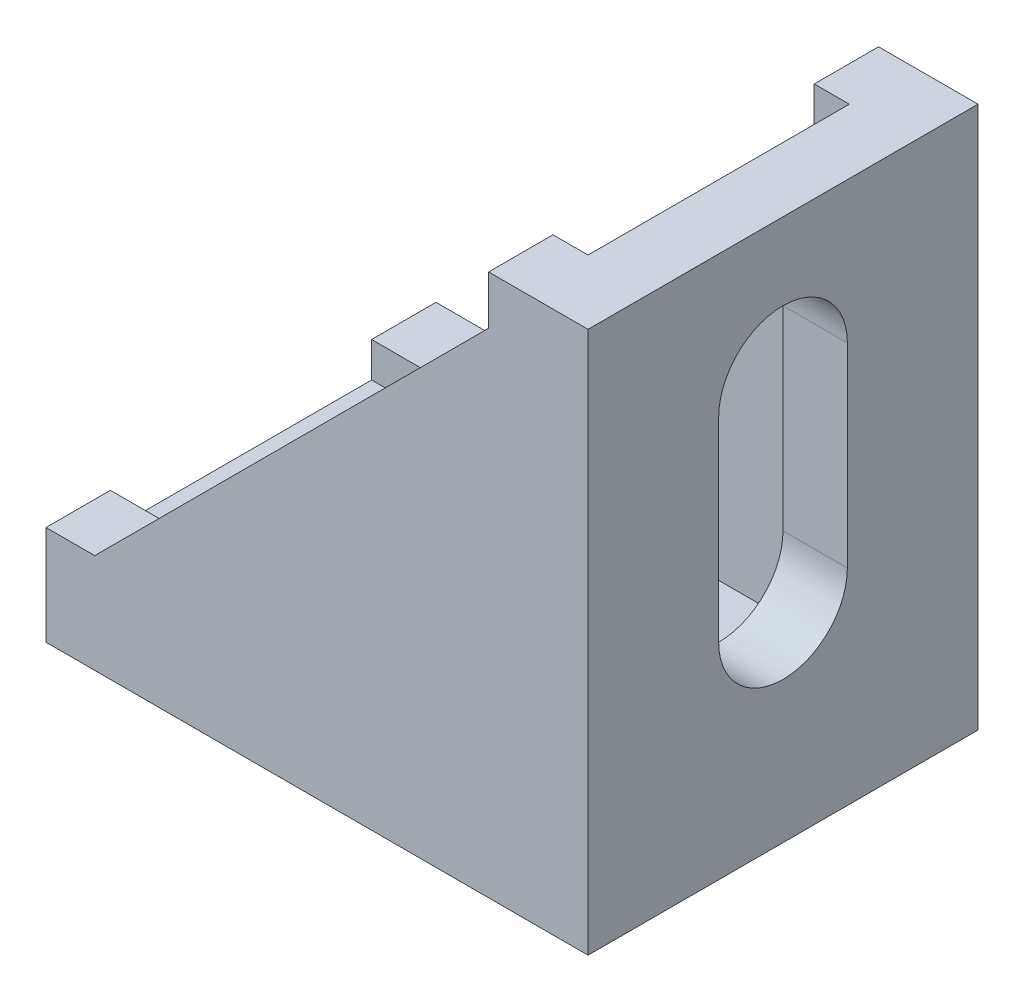
ISO-10303-21;
HEADER;
FILE_DESCRIPTION(('STEP AP214'),'2;1');
FILE_NAME('part.step','',(''),(''),'','','');
FILE_SCHEMA(('AUTOMOTIVE_DESIGN { 1 0 10303 214 1 1 1 1 }'));
ENDSEC;
DATA;
#1=APPLICATION_CONTEXT('core data for automotive mechanical design processes');
#2=APPLICATION_PROTOCOL_DEFINITION('international standard','automotive_design',2000,#1);
#3=PRODUCT_CONTEXT('',#1,'mechanical');
#4=PRODUCT('Part','Part','',(#3));
#5=PRODUCT_RELATED_PRODUCT_CATEGORY('part','',(#4));
#6=PRODUCT_DEFINITION_FORMATION('','',#4);
#7=PRODUCT_DEFINITION_CONTEXT('part definition',#1,'design');
#8=PRODUCT_DEFINITION('design','',#6,#7);
#9=PRODUCT_DEFINITION_SHAPE('','',#8);
#10=(LENGTH_UNIT() NAMED_UNIT(*) SI_UNIT(.MILLI.,.METRE.));
#11=(NAMED_UNIT(*) PLANE_ANGLE_UNIT() SI_UNIT($,.RADIAN.));
#12=(NAMED_UNIT(*) SI_UNIT($,.STERADIAN.) SOLID_ANGLE_UNIT());
#13=UNCERTAINTY_MEASURE_WITH_UNIT(LENGTH_MEASURE(1.E-05),#10,'distance_accuracy_value','');
#14=(GEOMETRIC_REPRESENTATION_CONTEXT(3) GLOBAL_UNCERTAINTY_ASSIGNED_CONTEXT((#13)) GLOBAL_UNIT_ASSIGNED_CONTEXT((#10,
#11,#12)) REPRESENTATION_CONTEXT('',''));
#15=CARTESIAN_POINT('',(0.,0.,0.));
#16=DIRECTION('',(0.,0.,1.));
#17=DIRECTION('',(1.,0.,0.));
#18=AXIS2_PLACEMENT_3D('',#15,#16,#17);
#19=CARTESIAN_POINT('',(13.9,3.3,-10.));
#20=DIRECTION('',(-1.,0.,0.));
#21=DIRECTION('',(0.,0.,1.));
#22=AXIS2_PLACEMENT_3D('',#19,#20,#21);
#23=PLANE('',#22);
#24=DIRECTION('',(0.,1.,0.));
#25=VECTOR('',#24,1.);
#26=CARTESIAN_POINT('',(13.9,3.3,3.3));
#27=LINE('',#26,#25);
#28=CARTESIAN_POINT('',(13.9,10.55,3.3));
#29=VERTEX_POINT('',#28);
#30=CARTESIAN_POINT('',(13.9,20.55,3.3));
#31=VERTEX_POINT('',#30);
#32=EDGE_CURVE('E239',#29,#31,#27,.T.);
#33=ORIENTED_EDGE('',*,*,#32,.T.);
#34=CARTESIAN_POINT('',(13.9,20.55,0.));
#35=DIRECTION('',(-1.,0.,0.));
#36=DIRECTION('',(0.,0.,1.));
#37=AXIS2_PLACEMENT_3D('',#34,#35,#36);
#38=CIRCLE('',#37,3.3);
#39=CARTESIAN_POINT('',(13.9,20.55,-3.3));
#40=VERTEX_POINT('',#39);
#41=EDGE_CURVE('E242',#31,#40,#38,.T.);
#42=ORIENTED_EDGE('',*,*,#41,.T.);
#43=DIRECTION('',(0.,-1.,0.));
#44=VECTOR('',#43,1.);
#45=CARTESIAN_POINT('',(13.9,3.3,-3.3));
#46=LINE('',#45,#44);
#47=CARTESIAN_POINT('',(13.9,10.55,-3.3));
#48=VERTEX_POINT('',#47);
#49=EDGE_CURVE('E227',#40,#48,#46,.T.);
#50=ORIENTED_EDGE('',*,*,#49,.T.);
#51=CARTESIAN_POINT('',(13.9,10.55,0.));
#52=DIRECTION('',(-1.,0.,0.));
#53=DIRECTION('',(0.,0.,1.));
#54=AXIS2_PLACEMENT_3D('',#51,#52,#53);
#55=CIRCLE('',#54,3.3);
#56=EDGE_CURVE('E236',#48,#29,#55,.T.);
#57=ORIENTED_EDGE('',*,*,#56,.T.);
#58=EDGE_LOOP('',(#33,#42,#50,#57));
#59=FACE_BOUND('',#58,.T.);
#60=DIRECTION('',(0.,0.,-1.));
#61=VECTOR('',#60,1.);
#62=CARTESIAN_POINT('',(13.9,0.,-10.));
#63=LINE('',#62,#61);
#64=CARTESIAN_POINT('',(13.9,0.,10.));
#65=VERTEX_POINT('',#64);
#66=CARTESIAN_POINT('',(13.9,0.,-10.));
#67=VERTEX_POINT('',#66);
#68=EDGE_CURVE('E317',#65,#67,#63,.T.);
#69=ORIENTED_EDGE('',*,*,#68,.T.);
#70=DIRECTION('',(0.,-1.,0.));
#71=VECTOR('',#70,1.);
#72=CARTESIAN_POINT('',(13.9,3.3,-10.));
#73=LINE('',#72,#71);
#74=CARTESIAN_POINT('',(13.9,27.8,-10.));
#75=VERTEX_POINT('',#74);
#76=EDGE_CURVE('E338',#75,#67,#73,.T.);
#77=ORIENTED_EDGE('',*,*,#76,.F.);
#78=DIRECTION('',(0.,0.,-1.));
#79=VECTOR('',#78,1.);
#80=CARTESIAN_POINT('',(13.9,27.8,10.));
#81=LINE('',#80,#79);
#82=CARTESIAN_POINT('',(13.9,27.8,10.));
#83=VERTEX_POINT('',#82);
#84=EDGE_CURVE('E297',#83,#75,#81,.T.);
#85=ORIENTED_EDGE('',*,*,#84,.F.);
#86=DIRECTION('',(0.,-1.,0.));
#87=VECTOR('',#86,1.);
#88=CARTESIAN_POINT('',(13.9,3.3,10.));
#89=LINE('',#88,#87);
#90=EDGE_CURVE('E321',#83,#65,#89,.T.);
#91=ORIENTED_EDGE('',*,*,#90,.T.);
#92=EDGE_LOOP('',(#69,#77,#85,#91));
#93=FACE_BOUND('',#92,.T.);
#94=ADVANCED_FACE('F37',(#59,#93),#23,.F.);
#95=CARTESIAN_POINT('',(-13.9,3.3,-10.));
#96=DIRECTION('',(0.,0.,1.));
#97=DIRECTION('',(1.,0.,0.));
#98=AXIS2_PLACEMENT_3D('',#95,#96,#97);
#99=PLANE('',#98);
#100=DIRECTION('',(0.707106781186547,0.707106781186548,0.));
#101=VECTOR('',#100,1.);
#102=CARTESIAN_POINT('',(-13.5492256094248,2.94922560942482,-10.));
#103=LINE('',#102,#101);
#104=CARTESIAN_POINT('',(-11.4,5.09845121884964,-10.));
#105=VERTEX_POINT('',#104);
#106=CARTESIAN_POINT('',(8.80154878115036,25.3,-10.));
#107=VERTEX_POINT('',#106);
#108=EDGE_CURVE('E280',#105,#107,#103,.T.);
#109=ORIENTED_EDGE('',*,*,#108,.T.);
#110=DIRECTION('',(0.,1.,0.));
#111=VECTOR('',#110,1.);
#112=CARTESIAN_POINT('',(8.80154878115036,3.3,-10.));
#113=LINE('',#112,#111);
#114=CARTESIAN_POINT('',(8.80154878115036,27.8,-10.));
#115=VERTEX_POINT('',#114);
#116=EDGE_CURVE('E268',#107,#115,#113,.T.);
#117=ORIENTED_EDGE('',*,*,#116,.T.);
#118=DIRECTION('',(-1.,0.,0.));
#119=VECTOR('',#118,1.);
#120=CARTESIAN_POINT('',(13.9,27.8,-10.));
#121=LINE('',#120,#119);
#122=EDGE_CURVE('E284',#75,#115,#121,.T.);
#123=ORIENTED_EDGE('',*,*,#122,.F.);
#124=ORIENTED_EDGE('',*,*,#76,.T.);
#125=DIRECTION('',(-1.,0.,0.));
#126=VECTOR('',#125,1.);
#127=CARTESIAN_POINT('',(-13.9,0.,-10.));
#128=LINE('',#127,#126);
#129=CARTESIAN_POINT('',(-13.9,0.,-10.));
#130=VERTEX_POINT('',#129);
#131=EDGE_CURVE('E325',#67,#130,#128,.T.);
#132=ORIENTED_EDGE('',*,*,#131,.T.);
#133=DIRECTION('',(0.,-1.,0.));
#134=VECTOR('',#133,1.);
#135=CARTESIAN_POINT('',(-13.9,3.3,-10.));
#136=LINE('',#135,#134);
#137=CARTESIAN_POINT('',(-13.9,5.09845121884964,-10.));
#138=VERTEX_POINT('',#137);
#139=EDGE_CURVE('E336',#138,#130,#136,.T.);
#140=ORIENTED_EDGE('',*,*,#139,.F.);
#141=DIRECTION('',(1.,0.,0.));
#142=VECTOR('',#141,1.);
#143=CARTESIAN_POINT('',(-13.9,5.09845121884964,-10.));
#144=LINE('',#143,#142);
#145=EDGE_CURVE('E274',#138,#105,#144,.T.);
#146=ORIENTED_EDGE('',*,*,#145,.T.);
#147=EDGE_LOOP('',(#109,#117,#123,#124,#132,#140,#146));
#148=FACE_BOUND('',#147,.T.);
#149=ADVANCED_FACE('F374',(#148),#99,.F.);
#150=CARTESIAN_POINT('',(-13.9,3.3,-10.));
#151=DIRECTION('',(1.,0.,0.));
#152=DIRECTION('',(0.,0.,-1.));
#153=AXIS2_PLACEMENT_3D('',#150,#151,#152);
#154=PLANE('',#153);
#155=DIRECTION('',(0.,-1.,0.));
#156=VECTOR('',#155,1.);
#157=CARTESIAN_POINT('',(-13.9,3.3,10.));
#158=LINE('',#157,#156);
#159=CARTESIAN_POINT('',(-13.9,5.09845121884964,10.));
#160=VERTEX_POINT('',#159);
#161=CARTESIAN_POINT('',(-13.9,0.,10.));
#162=VERTEX_POINT('',#161);
#163=EDGE_CURVE('E334',#160,#162,#158,.T.);
#164=ORIENTED_EDGE('',*,*,#163,.F.);
#165=DIRECTION('',(0.,0.,1.));
#166=VECTOR('',#165,1.);
#167=CARTESIAN_POINT('',(-13.9,5.09845121884964,-14.8));
#168=LINE('',#167,#166);
#169=CARTESIAN_POINT('',(-13.9,5.09845121884964,6.69999999999999));
#170=VERTEX_POINT('',#169);
#171=EDGE_CURVE('E253',#170,#160,#168,.T.);
#172=ORIENTED_EDGE('',*,*,#171,.F.);
#173=DIRECTION('',(0.,-1.,0.));
#174=VECTOR('',#173,1.);
#175=CARTESIAN_POINT('',(-13.9,27.8,6.7));
#176=LINE('',#175,#174);
#177=CARTESIAN_POINT('',(-13.9,3.3,6.7));
#178=VERTEX_POINT('',#177);
#179=EDGE_CURVE('E300',#170,#178,#176,.T.);
#180=ORIENTED_EDGE('',*,*,#179,.T.);
#181=DIRECTION('',(0.,0.,1.));
#182=VECTOR('',#181,1.);
#183=CARTESIAN_POINT('',(-13.9,3.3,-10.));
#184=LINE('',#183,#182);
#185=CARTESIAN_POINT('',(-13.9,3.3,-6.7));
#186=VERTEX_POINT('',#185);
#187=EDGE_CURVE('E318',#186,#178,#184,.T.);
#188=ORIENTED_EDGE('',*,*,#187,.F.);
#189=DIRECTION('',(0.,-1.,0.));
#190=VECTOR('',#189,1.);
#191=CARTESIAN_POINT('',(-13.9,27.8,-6.7));
#192=LINE('',#191,#190);
#193=CARTESIAN_POINT('',(-13.9,5.09845121884964,-6.7));
#194=VERTEX_POINT('',#193);
#195=EDGE_CURVE('E315',#194,#186,#192,.T.);
#196=ORIENTED_EDGE('',*,*,#195,.F.);
#197=EDGE_CURVE('E260',#138,#194,#168,.T.);
#198=ORIENTED_EDGE('',*,*,#197,.F.);
#199=ORIENTED_EDGE('',*,*,#139,.T.);
#200=DIRECTION('',(0.,0.,1.));
#201=VECTOR('',#200,1.);
#202=CARTESIAN_POINT('',(-13.9,0.,-10.));
#203=LINE('',#202,#201);
#204=EDGE_CURVE('E328',#130,#162,#203,.T.);
#205=ORIENTED_EDGE('',*,*,#204,.T.);
#206=EDGE_LOOP('',(#164,#172,#180,#188,#196,#198,#199,#205));
#207=FACE_BOUND('',#206,.T.);
#208=ADVANCED_FACE('F379',(#207),#154,.F.);
#209=CARTESIAN_POINT('',(-13.9,3.3,10.));
#210=DIRECTION('',(0.,0.,-1.));
#211=DIRECTION('',(-1.,0.,0.));
#212=AXIS2_PLACEMENT_3D('',#209,#210,#211);
#213=PLANE('',#212);
#214=DIRECTION('',(1.,0.,0.));
#215=VECTOR('',#214,1.);
#216=CARTESIAN_POINT('',(-13.9,27.8,10.));
#217=LINE('',#216,#215);
#218=CARTESIAN_POINT('',(8.80154878115036,27.8,10.));
#219=VERTEX_POINT('',#218);
#220=EDGE_CURVE('E295',#219,#83,#217,.T.);
#221=ORIENTED_EDGE('',*,*,#220,.F.);
#222=DIRECTION('',(0.,1.,0.));
#223=VECTOR('',#222,1.);
#224=CARTESIAN_POINT('',(8.80154878115036,27.8,10.));
#225=LINE('',#224,#223);
#226=CARTESIAN_POINT('',(8.80154878115036,25.3,10.));
#227=VERTEX_POINT('',#226);
#228=EDGE_CURVE('E251',#227,#219,#225,.T.);
#229=ORIENTED_EDGE('',*,*,#228,.F.);
#230=DIRECTION('',(0.707106781186547,0.707106781186548,0.));
#231=VECTOR('',#230,1.);
#232=CARTESIAN_POINT('',(-11.4,5.09845121884964,10.));
#233=LINE('',#232,#231);
#234=CARTESIAN_POINT('',(-11.4,5.09845121884964,10.));
#235=VERTEX_POINT('',#234);
#236=EDGE_CURVE('E248',#235,#227,#233,.T.);
#237=ORIENTED_EDGE('',*,*,#236,.F.);
#238=DIRECTION('',(1.,0.,0.));
#239=VECTOR('',#238,1.);
#240=CARTESIAN_POINT('',(-13.9,5.09845121884964,10.));
#241=LINE('',#240,#239);
#242=EDGE_CURVE('E245',#160,#235,#241,.T.);
#243=ORIENTED_EDGE('',*,*,#242,.F.);
#244=ORIENTED_EDGE('',*,*,#163,.T.);
#245=DIRECTION('',(1.,0.,0.));
#246=VECTOR('',#245,1.);
#247=CARTESIAN_POINT('',(-13.9,0.,10.));
#248=LINE('',#247,#246);
#249=EDGE_CURVE('E322',#162,#65,#248,.T.);
#250=ORIENTED_EDGE('',*,*,#249,.T.);
#251=ORIENTED_EDGE('',*,*,#90,.F.);
#252=EDGE_LOOP('',(#221,#229,#237,#243,#244,#250,#251));
#253=FACE_BOUND('',#252,.T.);
#254=ADVANCED_FACE('F397',(#253),#213,.F.);
#255=CARTESIAN_POINT('',(0.,3.3,0.));
#256=DIRECTION('',(0.,1.,0.));
#257=DIRECTION('',(0.,0.,1.));
#258=AXIS2_PLACEMENT_3D('',#255,#256,#257);
#259=PLANE('',#258);
#260=CARTESIAN_POINT('',(3.35,3.3,0.));
#261=DIRECTION('',(0.,1.,0.));
#262=DIRECTION('',(0.,0.,1.));
#263=AXIS2_PLACEMENT_3D('',#260,#261,#262);
#264=CIRCLE('',#263,3.3);
#265=CARTESIAN_POINT('',(3.35,3.3,3.3));
#266=VERTEX_POINT('',#265);
#267=CARTESIAN_POINT('',(3.35,3.3,-3.3));
#268=VERTEX_POINT('',#267);
#269=EDGE_CURVE('E51',#266,#268,#264,.T.);
#270=ORIENTED_EDGE('',*,*,#269,.F.);
#271=DIRECTION('',(1.,0.,0.));
#272=VECTOR('',#271,1.);
#273=CARTESIAN_POINT('',(3.35,3.3,3.3));
#274=LINE('',#273,#272);
#275=CARTESIAN_POINT('',(-6.65,3.3,3.3));
#276=VERTEX_POINT('',#275);
#277=EDGE_CURVE('E204',#276,#266,#274,.T.);
#278=ORIENTED_EDGE('',*,*,#277,.F.);
#279=CARTESIAN_POINT('',(-6.65,3.3,0.));
#280=DIRECTION('',(0.,1.,0.));
#281=DIRECTION('',(0.,0.,1.));
#282=AXIS2_PLACEMENT_3D('',#279,#280,#281);
#283=CIRCLE('',#282,3.3);
#284=CARTESIAN_POINT('',(-6.65,3.3,-3.3));
#285=VERTEX_POINT('',#284);
#286=EDGE_CURVE('E188',#285,#276,#283,.T.);
#287=ORIENTED_EDGE('',*,*,#286,.F.);
#288=DIRECTION('',(-1.,0.,0.));
#289=VECTOR('',#288,1.);
#290=CARTESIAN_POINT('',(3.35,3.3,-3.3));
#291=LINE('',#290,#289);
#292=EDGE_CURVE('E197',#268,#285,#291,.T.);
#293=ORIENTED_EDGE('',*,*,#292,.F.);
#294=EDGE_LOOP('',(#270,#278,#287,#293));
#295=FACE_BOUND('',#294,.T.);
#296=DIRECTION('',(-1.,0.,0.));
#297=VECTOR('',#296,1.);
#298=CARTESIAN_POINT('',(10.6,3.3,6.7));
#299=LINE('',#298,#297);
#300=CARTESIAN_POINT('',(10.6,3.3,6.7));
#301=VERTEX_POINT('',#300);
#302=EDGE_CURVE('E288',#301,#178,#299,.T.);
#303=ORIENTED_EDGE('',*,*,#302,.F.);
#304=DIRECTION('',(0.,0.,1.));
#305=VECTOR('',#304,1.);
#306=CARTESIAN_POINT('',(10.6,3.3,-6.7));
#307=LINE('',#306,#305);
#308=CARTESIAN_POINT('',(10.6,3.3,-6.7));
#309=VERTEX_POINT('',#308);
#310=EDGE_CURVE('E303',#309,#301,#307,.T.);
#311=ORIENTED_EDGE('',*,*,#310,.F.);
#312=DIRECTION('',(1.,0.,0.));
#313=VECTOR('',#312,1.);
#314=CARTESIAN_POINT('',(-13.9,3.3,-6.7));
#315=LINE('',#314,#313);
#316=EDGE_CURVE('E283',#186,#309,#315,.T.);
#317=ORIENTED_EDGE('',*,*,#316,.F.);
#318=ORIENTED_EDGE('',*,*,#187,.T.);
#319=EDGE_LOOP('',(#303,#311,#317,#318));
#320=FACE_BOUND('',#319,.T.);
#321=ADVANCED_FACE('F201',(#295,#320),#259,.T.);
#322=CARTESIAN_POINT('',(0.,0.,0.));
#323=DIRECTION('',(0.,1.,0.));
#324=DIRECTION('',(0.,0.,1.));
#325=AXIS2_PLACEMENT_3D('',#322,#323,#324);
#326=PLANE('',#325);
#327=DIRECTION('',(1.,0.,0.));
#328=VECTOR('',#327,1.);
#329=CARTESIAN_POINT('',(0.,0.,3.3));
#330=LINE('',#329,#328);
#331=CARTESIAN_POINT('',(-6.65,0.,3.3));
#332=VERTEX_POINT('',#331);
#333=CARTESIAN_POINT('',(3.35,0.,3.3));
#334=VERTEX_POINT('',#333);
#335=EDGE_CURVE('E44',#332,#334,#330,.T.);
#336=ORIENTED_EDGE('',*,*,#335,.T.);
#337=CARTESIAN_POINT('',(3.35,0.,0.));
#338=DIRECTION('',(0.,1.,0.));
#339=DIRECTION('',(0.,0.,1.));
#340=AXIS2_PLACEMENT_3D('',#337,#338,#339);
#341=CIRCLE('',#340,3.3);
#342=CARTESIAN_POINT('',(3.35,0.,-3.3));
#343=VERTEX_POINT('',#342);
#344=EDGE_CURVE('E11',#334,#343,#341,.T.);
#345=ORIENTED_EDGE('',*,*,#344,.T.);
#346=DIRECTION('',(-1.,0.,0.));
#347=VECTOR('',#346,1.);
#348=CARTESIAN_POINT('',(0.,0.,-3.3));
#349=LINE('',#348,#347);
#350=CARTESIAN_POINT('',(-6.65,0.,-3.3));
#351=VERTEX_POINT('',#350);
#352=EDGE_CURVE('E350',#343,#351,#349,.T.);
#353=ORIENTED_EDGE('',*,*,#352,.T.);
#354=CARTESIAN_POINT('',(-6.65,0.,0.));
#355=DIRECTION('',(0.,1.,0.));
#356=DIRECTION('',(0.,0.,1.));
#357=AXIS2_PLACEMENT_3D('',#354,#355,#356);
#358=CIRCLE('',#357,3.3);
#359=EDGE_CURVE('E191',#351,#332,#358,.T.);
#360=ORIENTED_EDGE('',*,*,#359,.T.);
#361=EDGE_LOOP('',(#336,#345,#353,#360));
#362=FACE_BOUND('',#361,.T.);
#363=ORIENTED_EDGE('',*,*,#68,.F.);
#364=ORIENTED_EDGE('',*,*,#249,.F.);
#365=ORIENTED_EDGE('',*,*,#204,.F.);
#366=ORIENTED_EDGE('',*,*,#131,.F.);
#367=EDGE_LOOP('',(#363,#364,#365,#366));
#368=FACE_BOUND('',#367,.T.);
#369=ADVANCED_FACE('F354',(#362,#368),#326,.F.);
#370=CARTESIAN_POINT('',(-13.9,27.8,-6.7));
#371=DIRECTION('',(0.,0.,-1.));
#372=DIRECTION('',(-1.,0.,0.));
#373=AXIS2_PLACEMENT_3D('',#370,#371,#372);
#374=PLANE('',#373);
#375=DIRECTION('',(1.,0.,0.));
#376=VECTOR('',#375,1.);
#377=CARTESIAN_POINT('',(-13.9,27.8,-6.7));
#378=LINE('',#377,#376);
#379=CARTESIAN_POINT('',(8.80154878115036,27.8,-6.7));
#380=VERTEX_POINT('',#379);
#381=CARTESIAN_POINT('',(10.6,27.8,-6.7));
#382=VERTEX_POINT('',#381);
#383=EDGE_CURVE('E287',#380,#382,#378,.T.);
#384=ORIENTED_EDGE('',*,*,#383,.F.);
#385=DIRECTION('',(0.,-1.,0.));
#386=VECTOR('',#385,1.);
#387=CARTESIAN_POINT('',(8.80154878115036,27.8,-6.7));
#388=LINE('',#387,#386);
#389=CARTESIAN_POINT('',(8.80154878115036,25.3,-6.7));
#390=VERTEX_POINT('',#389);
#391=EDGE_CURVE('E265',#380,#390,#388,.T.);
#392=ORIENTED_EDGE('',*,*,#391,.T.);
#393=DIRECTION('',(-0.707106781186547,-0.707106781186548,0.));
#394=VECTOR('',#393,1.);
#395=CARTESIAN_POINT('',(-1.29922560942482,15.1992256094248,-6.7));
#396=LINE('',#395,#394);
#397=CARTESIAN_POINT('',(-11.4,5.09845121884964,-6.7));
#398=VERTEX_POINT('',#397);
#399=EDGE_CURVE('E277',#390,#398,#396,.T.);
#400=ORIENTED_EDGE('',*,*,#399,.T.);
#401=DIRECTION('',(-1.,0.,0.));
#402=VECTOR('',#401,1.);
#403=CARTESIAN_POINT('',(-13.9,5.09845121884964,-6.7));
#404=LINE('',#403,#402);
#405=EDGE_CURVE('E271',#398,#194,#404,.T.);
#406=ORIENTED_EDGE('',*,*,#405,.T.);
#407=ORIENTED_EDGE('',*,*,#195,.T.);
#408=ORIENTED_EDGE('',*,*,#316,.T.);
#409=DIRECTION('',(0.,-1.,0.));
#410=VECTOR('',#409,1.);
#411=CARTESIAN_POINT('',(10.6,27.8,-6.7));
#412=LINE('',#411,#410);
#413=EDGE_CURVE('E312',#382,#309,#412,.T.);
#414=ORIENTED_EDGE('',*,*,#413,.F.);
#415=EDGE_LOOP('',(#384,#392,#400,#406,#407,#408,#414));
#416=FACE_BOUND('',#415,.T.);
#417=ADVANCED_FACE('F414',(#416),#374,.F.);
#418=CARTESIAN_POINT('',(10.6,27.8,-6.7));
#419=DIRECTION('',(1.,0.,0.));
#420=DIRECTION('',(0.,0.,-1.));
#421=AXIS2_PLACEMENT_3D('',#418,#419,#420);
#422=PLANE('',#421);
#423=DIRECTION('',(0.,-1.,0.));
#424=VECTOR('',#423,1.);
#425=CARTESIAN_POINT('',(10.6,20.55,-3.3));
#426=LINE('',#425,#424);
#427=CARTESIAN_POINT('',(10.6,20.55,-3.3));
#428=VERTEX_POINT('',#427);
#429=CARTESIAN_POINT('',(10.6,10.55,-3.3));
#430=VERTEX_POINT('',#429);
#431=EDGE_CURVE('E215',#428,#430,#426,.T.);
#432=ORIENTED_EDGE('',*,*,#431,.F.);
#433=CARTESIAN_POINT('',(10.6,20.55,0.));
#434=DIRECTION('',(-1.,0.,0.));
#435=DIRECTION('',(0.,0.,1.));
#436=AXIS2_PLACEMENT_3D('',#433,#434,#435);
#437=CIRCLE('',#436,3.3);
#438=CARTESIAN_POINT('',(10.6,20.55,3.3));
#439=VERTEX_POINT('',#438);
#440=EDGE_CURVE('E211',#439,#428,#437,.T.);
#441=ORIENTED_EDGE('',*,*,#440,.F.);
#442=DIRECTION('',(0.,1.,0.));
#443=VECTOR('',#442,1.);
#444=CARTESIAN_POINT('',(10.6,20.55,3.3));
#445=LINE('',#444,#443);
#446=CARTESIAN_POINT('',(10.6,10.55,3.3));
#447=VERTEX_POINT('',#446);
#448=EDGE_CURVE('E221',#447,#439,#445,.T.);
#449=ORIENTED_EDGE('',*,*,#448,.F.);
#450=CARTESIAN_POINT('',(10.6,10.55,0.));
#451=DIRECTION('',(-1.,0.,0.));
#452=DIRECTION('',(0.,0.,1.));
#453=AXIS2_PLACEMENT_3D('',#450,#451,#452);
#454=CIRCLE('',#453,3.3);
#455=EDGE_CURVE('E218',#430,#447,#454,.T.);
#456=ORIENTED_EDGE('',*,*,#455,.F.);
#457=EDGE_LOOP('',(#432,#441,#449,#456));
#458=FACE_BOUND('',#457,.T.);
#459=ORIENTED_EDGE('',*,*,#310,.T.);
#460=DIRECTION('',(0.,-1.,0.));
#461=VECTOR('',#460,1.);
#462=CARTESIAN_POINT('',(10.6,27.8,6.7));
#463=LINE('',#462,#461);
#464=CARTESIAN_POINT('',(10.6,27.8,6.7));
#465=VERTEX_POINT('',#464);
#466=EDGE_CURVE('E309',#465,#301,#463,.T.);
#467=ORIENTED_EDGE('',*,*,#466,.F.);
#468=DIRECTION('',(0.,0.,1.));
#469=VECTOR('',#468,1.);
#470=CARTESIAN_POINT('',(10.6,27.8,-6.7));
#471=LINE('',#470,#469);
#472=EDGE_CURVE('E290',#382,#465,#471,.T.);
#473=ORIENTED_EDGE('',*,*,#472,.F.);
#474=ORIENTED_EDGE('',*,*,#413,.T.);
#475=EDGE_LOOP('',(#459,#467,#473,#474));
#476=FACE_BOUND('',#475,.T.);
#477=ADVANCED_FACE('F452',(#458,#476),#422,.F.);
#478=CARTESIAN_POINT('',(10.6,27.8,6.7));
#479=DIRECTION('',(0.,0.,1.));
#480=DIRECTION('',(1.,0.,0.));
#481=AXIS2_PLACEMENT_3D('',#478,#479,#480);
#482=PLANE('',#481);
#483=DIRECTION('',(0.707106781186547,0.707106781186548,0.));
#484=VECTOR('',#483,1.);
#485=CARTESIAN_POINT('',(10.9507743905752,27.4492256094248,6.7));
#486=LINE('',#485,#484);
#487=CARTESIAN_POINT('',(-11.4,5.09845121884964,6.69999999999999));
#488=VERTEX_POINT('',#487);
#489=CARTESIAN_POINT('',(8.80154878115036,25.3,6.69999999999999));
#490=VERTEX_POINT('',#489);
#491=EDGE_CURVE('E347',#488,#490,#486,.T.);
#492=ORIENTED_EDGE('',*,*,#491,.T.);
#493=DIRECTION('',(0.,1.,0.));
#494=VECTOR('',#493,1.);
#495=CARTESIAN_POINT('',(8.80154878115036,27.8,6.7));
#496=LINE('',#495,#494);
#497=CARTESIAN_POINT('',(8.80154878115036,27.8,6.69999999999999));
#498=VERTEX_POINT('',#497);
#499=EDGE_CURVE('E262',#490,#498,#496,.T.);
#500=ORIENTED_EDGE('',*,*,#499,.T.);
#501=DIRECTION('',(-1.,0.,0.));
#502=VECTOR('',#501,1.);
#503=CARTESIAN_POINT('',(10.6,27.8,6.7));
#504=LINE('',#503,#502);
#505=EDGE_CURVE('E292',#465,#498,#504,.T.);
#506=ORIENTED_EDGE('',*,*,#505,.F.);
#507=ORIENTED_EDGE('',*,*,#466,.T.);
#508=ORIENTED_EDGE('',*,*,#302,.T.);
#509=ORIENTED_EDGE('',*,*,#179,.F.);
#510=DIRECTION('',(1.,0.,0.));
#511=VECTOR('',#510,1.);
#512=CARTESIAN_POINT('',(10.6,5.09845121884961,6.7));
#513=LINE('',#512,#511);
#514=EDGE_CURVE('E344',#170,#488,#513,.T.);
#515=ORIENTED_EDGE('',*,*,#514,.T.);
#516=EDGE_LOOP('',(#492,#500,#506,#507,#508,#509,#515));
#517=FACE_BOUND('',#516,.T.);
#518=ADVANCED_FACE('F427',(#517),#482,.F.);
#519=CARTESIAN_POINT('',(0.,27.8,0.));
#520=DIRECTION('',(0.,1.,0.));
#521=DIRECTION('',(0.,0.,1.));
#522=AXIS2_PLACEMENT_3D('',#519,#520,#521);
#523=PLANE('',#522);
#524=DIRECTION('',(0.,0.,-1.));
#525=VECTOR('',#524,1.);
#526=CARTESIAN_POINT('',(8.80154878115036,27.8,0.));
#527=LINE('',#526,#525);
#528=EDGE_CURVE('E343',#219,#498,#527,.T.);
#529=ORIENTED_EDGE('',*,*,#528,.F.);
#530=ORIENTED_EDGE('',*,*,#220,.T.);
#531=ORIENTED_EDGE('',*,*,#84,.T.);
#532=ORIENTED_EDGE('',*,*,#122,.T.);
#533=EDGE_CURVE('E341',#380,#115,#527,.T.);
#534=ORIENTED_EDGE('',*,*,#533,.F.);
#535=ORIENTED_EDGE('',*,*,#383,.T.);
#536=ORIENTED_EDGE('',*,*,#472,.T.);
#537=ORIENTED_EDGE('',*,*,#505,.T.);
#538=EDGE_LOOP('',(#529,#530,#531,#532,#534,#535,#536,#537));
#539=FACE_BOUND('',#538,.T.);
#540=ADVANCED_FACE('F392',(#539),#523,.T.);
#541=CARTESIAN_POINT('',(8.80154878115036,27.8,-14.8));
#542=DIRECTION('',(1.,0.,0.));
#543=DIRECTION('',(0.,0.,-1.));
#544=AXIS2_PLACEMENT_3D('',#541,#542,#543);
#545=PLANE('',#544);
#546=DIRECTION('',(0.,0.,1.));
#547=VECTOR('',#546,1.);
#548=CARTESIAN_POINT('',(8.80154878115036,25.3,-14.8));
#549=LINE('',#548,#547);
#550=EDGE_CURVE('E256',#107,#390,#549,.T.);
#551=ORIENTED_EDGE('',*,*,#550,.T.);
#552=ORIENTED_EDGE('',*,*,#391,.F.);
#553=ORIENTED_EDGE('',*,*,#533,.T.);
#554=ORIENTED_EDGE('',*,*,#116,.F.);
#555=EDGE_LOOP('',(#551,#552,#553,#554));
#556=FACE_BOUND('',#555,.T.);
#557=ADVANCED_FACE('F417',(#556),#545,.F.);
#558=CARTESIAN_POINT('',(-13.9,5.09845121884964,-14.8));
#559=DIRECTION('',(0.,-1.,0.));
#560=DIRECTION('',(1.,0.,0.));
#561=AXIS2_PLACEMENT_3D('',#558,#559,#560);
#562=PLANE('',#561);
#563=ORIENTED_EDGE('',*,*,#197,.T.);
#564=ORIENTED_EDGE('',*,*,#405,.F.);
#565=DIRECTION('',(0.,0.,1.));
#566=VECTOR('',#565,1.);
#567=CARTESIAN_POINT('',(-11.4,5.09845121884964,-14.8));
#568=LINE('',#567,#566);
#569=EDGE_CURVE('E257',#105,#398,#568,.T.);
#570=ORIENTED_EDGE('',*,*,#569,.F.);
#571=ORIENTED_EDGE('',*,*,#145,.F.);
#572=EDGE_LOOP('',(#563,#564,#570,#571));
#573=FACE_BOUND('',#572,.T.);
#574=ADVANCED_FACE('F407',(#573),#562,.F.);
#575=CARTESIAN_POINT('',(-11.4,5.09845121884964,-14.8));
#576=DIRECTION('',(0.707106781186548,-0.707106781186547,0.));
#577=DIRECTION('',(0.707106781186547,0.707106781186548,0.));
#578=AXIS2_PLACEMENT_3D('',#575,#576,#577);
#579=PLANE('',#578);
#580=ORIENTED_EDGE('',*,*,#569,.T.);
#581=ORIENTED_EDGE('',*,*,#399,.F.);
#582=ORIENTED_EDGE('',*,*,#550,.F.);
#583=ORIENTED_EDGE('',*,*,#108,.F.);
#584=EDGE_LOOP('',(#580,#581,#582,#583));
#585=FACE_BOUND('',#584,.T.);
#586=ADVANCED_FACE('F410',(#585),#579,.F.);
#587=EDGE_CURVE('E258',#488,#235,#568,.T.);
#588=ORIENTED_EDGE('',*,*,#587,.T.);
#589=ORIENTED_EDGE('',*,*,#236,.T.);
#590=EDGE_CURVE('E254',#490,#227,#549,.T.);
#591=ORIENTED_EDGE('',*,*,#590,.F.);
#592=ORIENTED_EDGE('',*,*,#491,.F.);
#593=EDGE_LOOP('',(#588,#589,#591,#592));
#594=FACE_BOUND('',#593,.T.);
#595=ADVANCED_FACE('F440',(#594),#579,.F.);
#596=ORIENTED_EDGE('',*,*,#171,.T.);
#597=ORIENTED_EDGE('',*,*,#242,.T.);
#598=ORIENTED_EDGE('',*,*,#587,.F.);
#599=ORIENTED_EDGE('',*,*,#514,.F.);
#600=EDGE_LOOP('',(#596,#597,#598,#599));
#601=FACE_BOUND('',#600,.T.);
#602=ADVANCED_FACE('F426',(#601),#562,.F.);
#603=ORIENTED_EDGE('',*,*,#590,.T.);
#604=ORIENTED_EDGE('',*,*,#228,.T.);
#605=ORIENTED_EDGE('',*,*,#528,.T.);
#606=ORIENTED_EDGE('',*,*,#499,.F.);
#607=EDGE_LOOP('',(#603,#604,#605,#606));
#608=FACE_BOUND('',#607,.T.);
#609=ADVANCED_FACE('F420',(#608),#545,.F.);
#610=CARTESIAN_POINT('',(35.4,20.55,0.));
#611=DIRECTION('',(-1.,0.,0.));
#612=DIRECTION('',(0.,0.,1.));
#613=AXIS2_PLACEMENT_3D('',#610,#611,#612);
#614=CYLINDRICAL_SURFACE('',#613,3.3);
#615=DIRECTION('',(-1.,0.,0.));
#616=VECTOR('',#615,1.);
#617=CARTESIAN_POINT('',(35.4,20.55,3.3));
#618=LINE('',#617,#616);
#619=EDGE_CURVE('E225',#31,#439,#618,.T.);
#620=ORIENTED_EDGE('',*,*,#619,.T.);
#621=ORIENTED_EDGE('',*,*,#440,.T.);
#622=DIRECTION('',(-1.,0.,0.));
#623=VECTOR('',#622,1.);
#624=CARTESIAN_POINT('',(35.4,20.55,-3.3));
#625=LINE('',#624,#623);
#626=EDGE_CURVE('E224',#40,#428,#625,.T.);
#627=ORIENTED_EDGE('',*,*,#626,.F.);
#628=ORIENTED_EDGE('',*,*,#41,.F.);
#629=EDGE_LOOP('',(#620,#621,#627,#628));
#630=FACE_BOUND('',#629,.T.);
#631=ADVANCED_FACE('F432',(#630),#614,.F.);
#632=CARTESIAN_POINT('',(35.4,20.55,3.3));
#633=DIRECTION('',(0.,0.,1.));
#634=DIRECTION('',(0.,-1.,0.));
#635=AXIS2_PLACEMENT_3D('',#632,#633,#634);
#636=PLANE('',#635);
#637=DIRECTION('',(-1.,0.,0.));
#638=VECTOR('',#637,1.);
#639=CARTESIAN_POINT('',(35.4,10.55,3.3));
#640=LINE('',#639,#638);
#641=EDGE_CURVE('E228',#29,#447,#640,.T.);
#642=ORIENTED_EDGE('',*,*,#641,.T.);
#643=ORIENTED_EDGE('',*,*,#448,.T.);
#644=ORIENTED_EDGE('',*,*,#619,.F.);
#645=ORIENTED_EDGE('',*,*,#32,.F.);
#646=EDGE_LOOP('',(#642,#643,#644,#645));
#647=FACE_BOUND('',#646,.T.);
#648=ADVANCED_FACE('F438',(#647),#636,.F.);
#649=CARTESIAN_POINT('',(35.4,10.55,0.));
#650=DIRECTION('',(-1.,0.,0.));
#651=DIRECTION('',(0.,0.,1.));
#652=AXIS2_PLACEMENT_3D('',#649,#650,#651);
#653=CYLINDRICAL_SURFACE('',#652,3.3);
#654=DIRECTION('',(-1.,0.,0.));
#655=VECTOR('',#654,1.);
#656=CARTESIAN_POINT('',(35.4,10.55,-3.3));
#657=LINE('',#656,#655);
#658=EDGE_CURVE('E230',#48,#430,#657,.T.);
#659=ORIENTED_EDGE('',*,*,#658,.T.);
#660=ORIENTED_EDGE('',*,*,#455,.T.);
#661=ORIENTED_EDGE('',*,*,#641,.F.);
#662=ORIENTED_EDGE('',*,*,#56,.F.);
#663=EDGE_LOOP('',(#659,#660,#661,#662));
#664=FACE_BOUND('',#663,.T.);
#665=ADVANCED_FACE('F368',(#664),#653,.F.);
#666=CARTESIAN_POINT('',(35.4,20.55,-3.3));
#667=DIRECTION('',(0.,0.,-1.));
#668=DIRECTION('',(0.,1.,0.));
#669=AXIS2_PLACEMENT_3D('',#666,#667,#668);
#670=PLANE('',#669);
#671=ORIENTED_EDGE('',*,*,#626,.T.);
#672=ORIENTED_EDGE('',*,*,#431,.T.);
#673=ORIENTED_EDGE('',*,*,#658,.F.);
#674=ORIENTED_EDGE('',*,*,#49,.F.);
#675=EDGE_LOOP('',(#671,#672,#673,#674));
#676=FACE_BOUND('',#675,.T.);
#677=ADVANCED_FACE('F361',(#676),#670,.F.);
#678=CARTESIAN_POINT('',(3.35,-21.5,0.));
#679=DIRECTION('',(0.,1.,0.));
#680=DIRECTION('',(0.,0.,1.));
#681=AXIS2_PLACEMENT_3D('',#678,#679,#680);
#682=CYLINDRICAL_SURFACE('',#681,3.3);
#683=DIRECTION('',(0.,1.,0.));
#684=VECTOR('',#683,1.);
#685=CARTESIAN_POINT('',(3.35,-21.5,3.3));
#686=LINE('',#685,#684);
#687=EDGE_CURVE('E209',#334,#266,#686,.T.);
#688=ORIENTED_EDGE('',*,*,#687,.T.);
#689=ORIENTED_EDGE('',*,*,#269,.T.);
#690=DIRECTION('',(0.,1.,0.));
#691=VECTOR('',#690,1.);
#692=CARTESIAN_POINT('',(3.35,-21.5,-3.3));
#693=LINE('',#692,#691);
#694=EDGE_CURVE('E194',#343,#268,#693,.T.);
#695=ORIENTED_EDGE('',*,*,#694,.F.);
#696=ORIENTED_EDGE('',*,*,#344,.F.);
#697=EDGE_LOOP('',(#688,#689,#695,#696));
#698=FACE_BOUND('',#697,.T.);
#699=ADVANCED_FACE('F359',(#698),#682,.F.);
#700=CARTESIAN_POINT('',(3.35,-21.5,3.3));
#701=DIRECTION('',(0.,0.,1.));
#702=DIRECTION('',(1.,0.,0.));
#703=AXIS2_PLACEMENT_3D('',#700,#701,#702);
#704=PLANE('',#703);
#705=DIRECTION('',(0.,1.,0.));
#706=VECTOR('',#705,1.);
#707=CARTESIAN_POINT('',(-6.65,-21.5,3.3));
#708=LINE('',#707,#706);
#709=EDGE_CURVE('E193',#332,#276,#708,.T.);
#710=ORIENTED_EDGE('',*,*,#709,.T.);
#711=ORIENTED_EDGE('',*,*,#277,.T.);
#712=ORIENTED_EDGE('',*,*,#687,.F.);
#713=ORIENTED_EDGE('',*,*,#335,.F.);
#714=EDGE_LOOP('',(#710,#711,#712,#713));
#715=FACE_BOUND('',#714,.T.);
#716=ADVANCED_FACE('F358',(#715),#704,.F.);
#717=CARTESIAN_POINT('',(-6.65,-21.5,0.));
#718=DIRECTION('',(0.,1.,0.));
#719=DIRECTION('',(0.,0.,1.));
#720=AXIS2_PLACEMENT_3D('',#717,#718,#719);
#721=CYLINDRICAL_SURFACE('',#720,3.3);
#722=DIRECTION('',(0.,1.,0.));
#723=VECTOR('',#722,1.);
#724=CARTESIAN_POINT('',(-6.65,-21.5,-3.3));
#725=LINE('',#724,#723);
#726=EDGE_CURVE('E59',#351,#285,#725,.T.);
#727=ORIENTED_EDGE('',*,*,#726,.T.);
#728=ORIENTED_EDGE('',*,*,#286,.T.);
#729=ORIENTED_EDGE('',*,*,#709,.F.);
#730=ORIENTED_EDGE('',*,*,#359,.F.);
#731=EDGE_LOOP('',(#727,#728,#729,#730));
#732=FACE_BOUND('',#731,.T.);
#733=ADVANCED_FACE('F185',(#732),#721,.F.);
#734=CARTESIAN_POINT('',(3.35,-21.5,-3.3));
#735=DIRECTION('',(0.,0.,-1.));
#736=DIRECTION('',(-1.,0.,0.));
#737=AXIS2_PLACEMENT_3D('',#734,#735,#736);
#738=PLANE('',#737);
#739=ORIENTED_EDGE('',*,*,#694,.T.);
#740=ORIENTED_EDGE('',*,*,#292,.T.);
#741=ORIENTED_EDGE('',*,*,#726,.F.);
#742=ORIENTED_EDGE('',*,*,#352,.F.);
#743=EDGE_LOOP('',(#739,#740,#741,#742));
#744=FACE_BOUND('',#743,.T.);
#745=ADVANCED_FACE('F198',(#744),#738,.F.);
#746=CLOSED_SHELL('',(#94,#149,#208,#254,#321,#369,#417,#477,#518,#540,#557,#574,#586,#595,#602,
#609,#631,#648,#665,#677,#699,#716,#733,#745));
#747=MANIFOLD_SOLID_BREP('B2',#746);
#748=ADVANCED_BREP_SHAPE_REPRESENTATION('',(#18,#747),#14);
#749=SHAPE_DEFINITION_REPRESENTATION(#9,#748);
ENDSEC;
END-ISO-10303-21;
